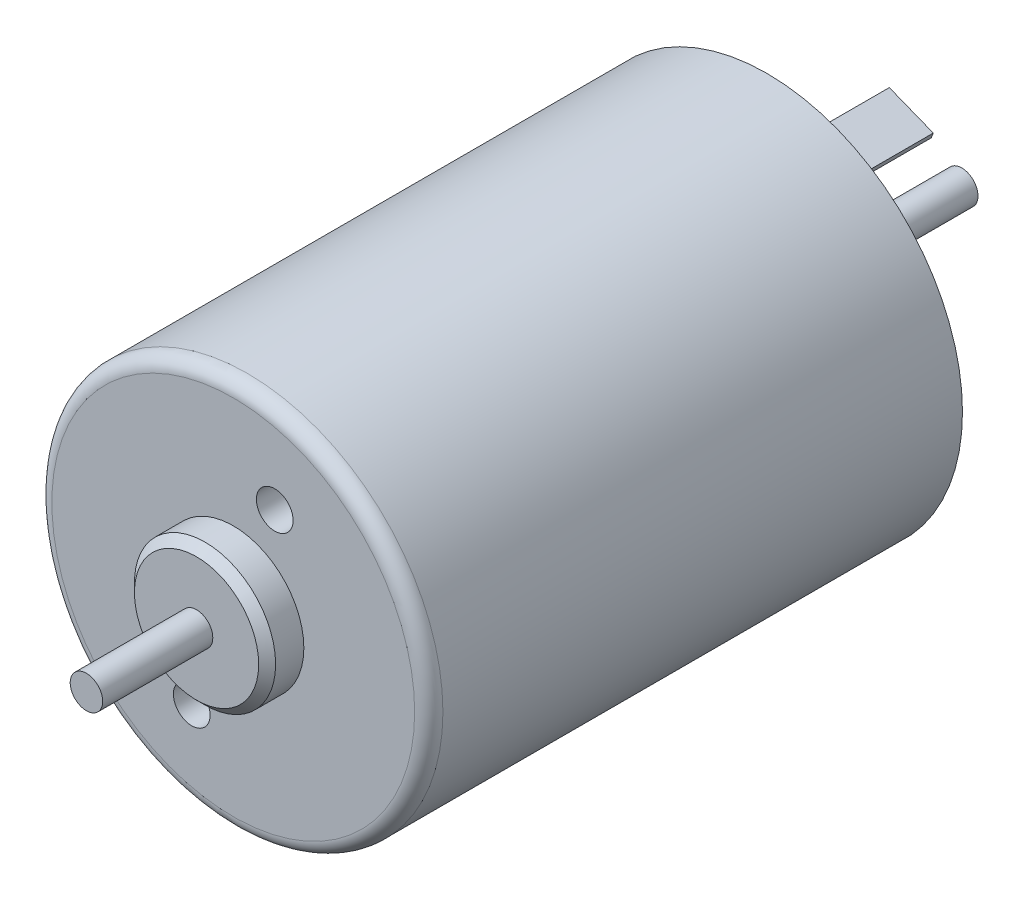
ISO-10303-21;
HEADER;
FILE_DESCRIPTION(('STEP AP214'),'2;1');
FILE_NAME('part.step','',(''),(''),'','','');
FILE_SCHEMA(('AUTOMOTIVE_DESIGN { 1 0 10303 214 1 1 1 1 }'));
ENDSEC;
DATA;
#1=APPLICATION_CONTEXT('core data for automotive mechanical design processes');
#2=APPLICATION_PROTOCOL_DEFINITION('international standard','automotive_design',2000,#1);
#3=PRODUCT_CONTEXT('',#1,'mechanical');
#4=PRODUCT('Part','Part','',(#3));
#5=PRODUCT_RELATED_PRODUCT_CATEGORY('part','',(#4));
#6=PRODUCT_DEFINITION_FORMATION('','',#4);
#7=PRODUCT_DEFINITION_CONTEXT('part definition',#1,'design');
#8=PRODUCT_DEFINITION('design','',#6,#7);
#9=PRODUCT_DEFINITION_SHAPE('','',#8);
#10=(LENGTH_UNIT() NAMED_UNIT(*) SI_UNIT(.MILLI.,.METRE.));
#11=(NAMED_UNIT(*) PLANE_ANGLE_UNIT() SI_UNIT($,.RADIAN.));
#12=(NAMED_UNIT(*) SI_UNIT($,.STERADIAN.) SOLID_ANGLE_UNIT());
#13=UNCERTAINTY_MEASURE_WITH_UNIT(LENGTH_MEASURE(1.E-05),#10,'distance_accuracy_value','');
#14=(GEOMETRIC_REPRESENTATION_CONTEXT(3) GLOBAL_UNCERTAINTY_ASSIGNED_CONTEXT((#13)) GLOBAL_UNIT_ASSIGNED_CONTEXT((#10,
#11,#12)) REPRESENTATION_CONTEXT('',''));
#15=CARTESIAN_POINT('',(0.,0.,0.));
#16=DIRECTION('',(0.,0.,1.));
#17=DIRECTION('',(1.,0.,0.));
#18=AXIS2_PLACEMENT_3D('',#15,#16,#17);
#19=CARTESIAN_POINT('',(0.,0.,0.));
#20=DIRECTION('',(0.,0.,-1.));
#21=DIRECTION('',(0.,1.,0.));
#22=AXIS2_PLACEMENT_3D('',#19,#20,#21);
#23=PLANE('',#22);
#24=CARTESIAN_POINT('',(0.,0.,0.));
#25=DIRECTION('',(0.,0.,-1.));
#26=DIRECTION('',(0.,1.,0.));
#27=AXIS2_PLACEMENT_3D('',#24,#25,#26);
#28=CIRCLE('',#27,5.);
#29=CARTESIAN_POINT('',(0.,5.,0.));
#30=VERTEX_POINT('',#29);
#31=EDGE_CURVE('E226',#30,#30,#28,.T.);
#32=ORIENTED_EDGE('',*,*,#31,.F.);
#33=EDGE_LOOP('',(#32));
#34=FACE_BOUND('',#33,.T.);
#35=CARTESIAN_POINT('',(0.,0.,0.));
#36=DIRECTION('',(0.,0.,-1.));
#37=DIRECTION('',(0.,1.,0.));
#38=AXIS2_PLACEMENT_3D('',#35,#36,#37);
#39=CIRCLE('',#38,13.85);
#40=CARTESIAN_POINT('',(0.,13.85,0.));
#41=VERTEX_POINT('',#40);
#42=EDGE_CURVE('E155',#41,#41,#39,.T.);
#43=ORIENTED_EDGE('',*,*,#42,.T.);
#44=EDGE_LOOP('',(#43));
#45=FACE_BOUND('',#44,.T.);
#46=DIRECTION('',(-0.93007568020905,0.367367975038207,0.));
#47=VECTOR('',#46,1.);
#48=CARTESIAN_POINT('',(2.51990775857389,10.9391814085095,0.));
#49=LINE('',#48,#47);
#50=CARTESIAN_POINT('',(5.63566128727422,9.70849869213148,0.));
#51=VERTEX_POINT('',#50);
#52=CARTESIAN_POINT('',(2.51990775857389,10.9391814085095,0.));
#53=VERTEX_POINT('',#52);
#54=EDGE_CURVE('E127',#51,#53,#49,.T.);
#55=ORIENTED_EDGE('',*,*,#54,.F.);
#56=DIRECTION('',(-0.367367975038209,-0.93007568020905,0.));
#57=VECTOR('',#56,1.);
#58=CARTESIAN_POINT('',(5.63566128727422,9.70849869213148,0.));
#59=LINE('',#58,#57);
#60=CARTESIAN_POINT('',(5.7826084772895,10.0805289642151,0.));
#61=VERTEX_POINT('',#60);
#62=EDGE_CURVE('E124',#61,#51,#59,.T.);
#63=ORIENTED_EDGE('',*,*,#62,.F.);
#64=DIRECTION('',(0.93007568020905,-0.367367975038207,0.));
#65=VECTOR('',#64,1.);
#66=CARTESIAN_POINT('',(5.7826084772895,10.0805289642151,0.));
#67=LINE('',#66,#65);
#68=CARTESIAN_POINT('',(2.66685494858918,11.3112116805931,0.));
#69=VERTEX_POINT('',#68);
#70=EDGE_CURVE('E136',#69,#61,#67,.T.);
#71=ORIENTED_EDGE('',*,*,#70,.F.);
#72=DIRECTION('',(0.367367975038208,0.93007568020905,0.));
#73=VECTOR('',#72,1.);
#74=CARTESIAN_POINT('',(2.66685494858918,11.3112116805931,0.));
#75=LINE('',#74,#73);
#76=EDGE_CURVE('E144',#53,#69,#75,.T.);
#77=ORIENTED_EDGE('',*,*,#76,.F.);
#78=EDGE_LOOP('',(#55,#63,#71,#77));
#79=FACE_BOUND('',#78,.T.);
#80=DIRECTION('',(-0.930075680209049,0.367367975038209,0.));
#81=VECTOR('',#80,1.);
#82=CARTESIAN_POINT('',(-5.7826084772895,-10.0805289642151,0.));
#83=LINE('',#82,#81);
#84=CARTESIAN_POINT('',(-2.66685494858918,-11.3112116805931,0.));
#85=VERTEX_POINT('',#84);
#86=CARTESIAN_POINT('',(-5.7826084772895,-10.0805289642151,0.));
#87=VERTEX_POINT('',#86);
#88=EDGE_CURVE('E247',#85,#87,#83,.T.);
#89=ORIENTED_EDGE('',*,*,#88,.F.);
#90=DIRECTION('',(-0.36736797503821,-0.930075680209049,0.));
#91=VECTOR('',#90,1.);
#92=CARTESIAN_POINT('',(-2.66685494858918,-11.3112116805931,0.));
#93=LINE('',#92,#91);
#94=CARTESIAN_POINT('',(-2.5199077585739,-10.9391814085095,0.));
#95=VERTEX_POINT('',#94);
#96=EDGE_CURVE('E122',#95,#85,#93,.T.);
#97=ORIENTED_EDGE('',*,*,#96,.F.);
#98=DIRECTION('',(0.930075680209049,-0.367367975038209,0.));
#99=VECTOR('',#98,1.);
#100=CARTESIAN_POINT('',(-2.5199077585739,-10.9391814085095,0.));
#101=LINE('',#100,#99);
#102=CARTESIAN_POINT('',(-5.63566128727422,-9.7084986921315,0.));
#103=VERTEX_POINT('',#102);
#104=EDGE_CURVE('E118',#103,#95,#101,.T.);
#105=ORIENTED_EDGE('',*,*,#104,.F.);
#106=DIRECTION('',(0.367367975038208,0.93007568020905,0.));
#107=VECTOR('',#106,1.);
#108=CARTESIAN_POINT('',(-5.63566128727422,-9.70849869213149,0.));
#109=LINE('',#108,#107);
#110=EDGE_CURVE('E249',#87,#103,#109,.T.);
#111=ORIENTED_EDGE('',*,*,#110,.F.);
#112=EDGE_LOOP('',(#89,#97,#105,#111));
#113=FACE_BOUND('',#112,.T.);
#114=ADVANCED_FACE('F33',(#34,#45,#79,#113),#23,.T.);
#115=CARTESIAN_POINT('',(0.,0.,32.9));
#116=DIRECTION('',(0.,0.,-1.));
#117=DIRECTION('',(0.,1.,0.));
#118=AXIS2_PLACEMENT_3D('',#115,#116,#117);
#119=CYLINDRICAL_SURFACE('',#118,13.85);
#120=CARTESIAN_POINT('',(0.,0.,36.8));
#121=DIRECTION('',(0.,0.,1.));
#122=DIRECTION('',(1.,0.,0.));
#123=AXIS2_PLACEMENT_3D('',#120,#121,#122);
#124=CIRCLE('',#123,13.85);
#125=CARTESIAN_POINT('',(13.85,0.,36.8));
#126=VERTEX_POINT('',#125);
#127=EDGE_CURVE('E11',#126,#126,#124,.F.);
#128=ORIENTED_EDGE('',*,*,#127,.T.);
#129=EDGE_LOOP('',(#128));
#130=FACE_BOUND('',#129,.T.);
#131=ORIENTED_EDGE('',*,*,#42,.F.);
#132=EDGE_LOOP('',(#131));
#133=FACE_BOUND('',#132,.T.);
#134=ADVANCED_FACE('F185',(#130,#133),#119,.T.);
#135=CARTESIAN_POINT('',(5.63566128727422,9.70849869213148,-6.));
#136=DIRECTION('',(-0.930075680209049,0.367367975038209,0.));
#137=DIRECTION('',(-0.367367975038209,-0.93007568020905,0.));
#138=AXIS2_PLACEMENT_3D('',#135,#136,#137);
#139=PLANE('',#138);
#140=ORIENTED_EDGE('',*,*,#62,.T.);
#141=DIRECTION('',(0.,0.,1.));
#142=VECTOR('',#141,1.);
#143=CARTESIAN_POINT('',(5.63566128727422,9.70849869213148,-6.));
#144=LINE('',#143,#142);
#145=CARTESIAN_POINT('',(5.63566128727422,9.70849869213148,-6.));
#146=VERTEX_POINT('',#145);
#147=EDGE_CURVE('E153',#146,#51,#144,.T.);
#148=ORIENTED_EDGE('',*,*,#147,.F.);
#149=DIRECTION('',(-0.367367975038209,-0.93007568020905,0.));
#150=VECTOR('',#149,1.);
#151=CARTESIAN_POINT('',(5.63566128727422,9.70849869213148,-6.));
#152=LINE('',#151,#150);
#153=CARTESIAN_POINT('',(5.7826084772895,10.0805289642151,-6.));
#154=VERTEX_POINT('',#153);
#155=EDGE_CURVE('E132',#154,#146,#152,.T.);
#156=ORIENTED_EDGE('',*,*,#155,.F.);
#157=DIRECTION('',(0.,0.,1.));
#158=VECTOR('',#157,1.);
#159=CARTESIAN_POINT('',(5.7826084772895,10.0805289642151,-6.));
#160=LINE('',#159,#158);
#161=EDGE_CURVE('E141',#154,#61,#160,.T.);
#162=ORIENTED_EDGE('',*,*,#161,.T.);
#163=EDGE_LOOP('',(#140,#148,#156,#162));
#164=FACE_BOUND('',#163,.T.);
#165=ADVANCED_FACE('F191',(#164),#139,.F.);
#166=CARTESIAN_POINT('',(2.51990775857389,10.9391814085095,-6.));
#167=DIRECTION('',(0.367367975038207,0.93007568020905,0.));
#168=DIRECTION('',(-0.93007568020905,0.367367975038207,0.));
#169=AXIS2_PLACEMENT_3D('',#166,#167,#168);
#170=PLANE('',#169);
#171=ORIENTED_EDGE('',*,*,#54,.T.);
#172=DIRECTION('',(0.,0.,1.));
#173=VECTOR('',#172,1.);
#174=CARTESIAN_POINT('',(2.51990775857389,10.9391814085095,-6.));
#175=LINE('',#174,#173);
#176=CARTESIAN_POINT('',(2.51990775857389,10.9391814085095,-6.));
#177=VERTEX_POINT('',#176);
#178=EDGE_CURVE('E150',#177,#53,#175,.T.);
#179=ORIENTED_EDGE('',*,*,#178,.F.);
#180=DIRECTION('',(-0.93007568020905,0.367367975038207,0.));
#181=VECTOR('',#180,1.);
#182=CARTESIAN_POINT('',(2.51990775857389,10.9391814085095,-6.));
#183=LINE('',#182,#181);
#184=EDGE_CURVE('E135',#146,#177,#183,.T.);
#185=ORIENTED_EDGE('',*,*,#184,.F.);
#186=ORIENTED_EDGE('',*,*,#147,.T.);
#187=EDGE_LOOP('',(#171,#179,#185,#186));
#188=FACE_BOUND('',#187,.T.);
#189=ADVANCED_FACE('F281',(#188),#170,.F.);
#190=CARTESIAN_POINT('',(2.66685494858918,11.3112116805931,-6.));
#191=DIRECTION('',(0.93007568020905,-0.367367975038208,0.));
#192=DIRECTION('',(0.367367975038208,0.93007568020905,0.));
#193=AXIS2_PLACEMENT_3D('',#190,#191,#192);
#194=PLANE('',#193);
#195=ORIENTED_EDGE('',*,*,#76,.T.);
#196=DIRECTION('',(0.,0.,1.));
#197=VECTOR('',#196,1.);
#198=CARTESIAN_POINT('',(2.66685494858918,11.3112116805931,-6.));
#199=LINE('',#198,#197);
#200=CARTESIAN_POINT('',(2.66685494858918,11.3112116805931,-6.));
#201=VERTEX_POINT('',#200);
#202=EDGE_CURVE('E56',#201,#69,#199,.T.);
#203=ORIENTED_EDGE('',*,*,#202,.F.);
#204=DIRECTION('',(0.367367975038208,0.93007568020905,0.));
#205=VECTOR('',#204,1.);
#206=CARTESIAN_POINT('',(2.66685494858918,11.3112116805931,-6.));
#207=LINE('',#206,#205);
#208=EDGE_CURVE('E138',#177,#201,#207,.T.);
#209=ORIENTED_EDGE('',*,*,#208,.F.);
#210=ORIENTED_EDGE('',*,*,#178,.T.);
#211=EDGE_LOOP('',(#195,#203,#209,#210));
#212=FACE_BOUND('',#211,.T.);
#213=ADVANCED_FACE('F279',(#212),#194,.F.);
#214=CARTESIAN_POINT('',(5.7826084772895,10.0805289642151,-6.));
#215=DIRECTION('',(-0.367367975038207,-0.93007568020905,0.));
#216=DIRECTION('',(0.93007568020905,-0.367367975038207,0.));
#217=AXIS2_PLACEMENT_3D('',#214,#215,#216);
#218=PLANE('',#217);
#219=ORIENTED_EDGE('',*,*,#70,.T.);
#220=ORIENTED_EDGE('',*,*,#161,.F.);
#221=DIRECTION('',(0.93007568020905,-0.367367975038207,0.));
#222=VECTOR('',#221,1.);
#223=CARTESIAN_POINT('',(5.7826084772895,10.0805289642151,-6.));
#224=LINE('',#223,#222);
#225=EDGE_CURVE('E140',#201,#154,#224,.T.);
#226=ORIENTED_EDGE('',*,*,#225,.F.);
#227=ORIENTED_EDGE('',*,*,#202,.T.);
#228=EDGE_LOOP('',(#219,#220,#226,#227));
#229=FACE_BOUND('',#228,.T.);
#230=ADVANCED_FACE('F275',(#229),#218,.F.);
#231=CARTESIAN_POINT('',(0.,0.,-6.));
#232=DIRECTION('',(0.,0.,1.));
#233=DIRECTION('',(0.,-1.,0.));
#234=AXIS2_PLACEMENT_3D('',#231,#232,#233);
#235=PLANE('',#234);
#236=ORIENTED_EDGE('',*,*,#155,.T.);
#237=ORIENTED_EDGE('',*,*,#184,.T.);
#238=ORIENTED_EDGE('',*,*,#208,.T.);
#239=ORIENTED_EDGE('',*,*,#225,.T.);
#240=EDGE_LOOP('',(#236,#237,#238,#239));
#241=FACE_BOUND('',#240,.T.);
#242=ADVANCED_FACE('F272',(#241),#235,.F.);
#243=CARTESIAN_POINT('',(-2.66685494858918,-11.3112116805931,-6.));
#244=DIRECTION('',(-0.930075680209049,0.36736797503821,0.));
#245=DIRECTION('',(-0.36736797503821,-0.930075680209049,0.));
#246=AXIS2_PLACEMENT_3D('',#243,#244,#245);
#247=PLANE('',#246);
#248=ORIENTED_EDGE('',*,*,#96,.T.);
#249=DIRECTION('',(0.,0.,1.));
#250=VECTOR('',#249,1.);
#251=CARTESIAN_POINT('',(-2.66685494858918,-11.3112116805931,-6.));
#252=LINE('',#251,#250);
#253=CARTESIAN_POINT('',(-2.66685494858918,-11.3112116805931,-6.));
#254=VERTEX_POINT('',#253);
#255=EDGE_CURVE('E103',#254,#85,#252,.T.);
#256=ORIENTED_EDGE('',*,*,#255,.F.);
#257=DIRECTION('',(-0.36736797503821,-0.930075680209049,0.));
#258=VECTOR('',#257,1.);
#259=CARTESIAN_POINT('',(-2.66685494858918,-11.3112116805931,-6.));
#260=LINE('',#259,#258);
#261=CARTESIAN_POINT('',(-2.5199077585739,-10.9391814085095,-6.));
#262=VERTEX_POINT('',#261);
#263=EDGE_CURVE('E110',#262,#254,#260,.T.);
#264=ORIENTED_EDGE('',*,*,#263,.F.);
#265=DIRECTION('',(0.,0.,1.));
#266=VECTOR('',#265,1.);
#267=CARTESIAN_POINT('',(-2.5199077585739,-10.9391814085095,-6.));
#268=LINE('',#267,#266);
#269=EDGE_CURVE('E245',#262,#95,#268,.T.);
#270=ORIENTED_EDGE('',*,*,#269,.T.);
#271=EDGE_LOOP('',(#248,#256,#264,#270));
#272=FACE_BOUND('',#271,.T.);
#273=ADVANCED_FACE('F120',(#272),#247,.F.);
#274=CARTESIAN_POINT('',(-5.7826084772895,-10.0805289642151,-6.));
#275=DIRECTION('',(0.367367975038209,0.930075680209049,0.));
#276=DIRECTION('',(-0.93007568020905,0.367367975038209,0.));
#277=AXIS2_PLACEMENT_3D('',#274,#275,#276);
#278=PLANE('',#277);
#279=ORIENTED_EDGE('',*,*,#88,.T.);
#280=DIRECTION('',(0.,0.,1.));
#281=VECTOR('',#280,1.);
#282=CARTESIAN_POINT('',(-5.7826084772895,-10.0805289642151,-6.));
#283=LINE('',#282,#281);
#284=CARTESIAN_POINT('',(-5.7826084772895,-10.0805289642151,-6.));
#285=VERTEX_POINT('',#284);
#286=EDGE_CURVE('E106',#285,#87,#283,.T.);
#287=ORIENTED_EDGE('',*,*,#286,.F.);
#288=DIRECTION('',(-0.930075680209049,0.367367975038209,0.));
#289=VECTOR('',#288,1.);
#290=CARTESIAN_POINT('',(-5.7826084772895,-10.0805289642151,-6.));
#291=LINE('',#290,#289);
#292=EDGE_CURVE('E99',#254,#285,#291,.T.);
#293=ORIENTED_EDGE('',*,*,#292,.F.);
#294=ORIENTED_EDGE('',*,*,#255,.T.);
#295=EDGE_LOOP('',(#279,#287,#293,#294));
#296=FACE_BOUND('',#295,.T.);
#297=ADVANCED_FACE('F101',(#296),#278,.F.);
#298=CARTESIAN_POINT('',(-5.63566128727422,-9.70849869213149,-6.));
#299=DIRECTION('',(0.930075680209049,-0.367367975038208,0.));
#300=DIRECTION('',(0.367367975038208,0.93007568020905,0.));
#301=AXIS2_PLACEMENT_3D('',#298,#299,#300);
#302=PLANE('',#301);
#303=ORIENTED_EDGE('',*,*,#110,.T.);
#304=DIRECTION('',(0.,0.,1.));
#305=VECTOR('',#304,1.);
#306=CARTESIAN_POINT('',(-5.63566128727422,-9.70849869213149,-6.));
#307=LINE('',#306,#305);
#308=CARTESIAN_POINT('',(-5.63566128727422,-9.70849869213149,-6.));
#309=VERTEX_POINT('',#308);
#310=EDGE_CURVE('E48',#309,#103,#307,.T.);
#311=ORIENTED_EDGE('',*,*,#310,.F.);
#312=DIRECTION('',(0.367367975038208,0.93007568020905,0.));
#313=VECTOR('',#312,1.);
#314=CARTESIAN_POINT('',(-5.63566128727422,-9.70849869213149,-6.));
#315=LINE('',#314,#313);
#316=EDGE_CURVE('E109',#285,#309,#315,.T.);
#317=ORIENTED_EDGE('',*,*,#316,.F.);
#318=ORIENTED_EDGE('',*,*,#286,.T.);
#319=EDGE_LOOP('',(#303,#311,#317,#318));
#320=FACE_BOUND('',#319,.T.);
#321=ADVANCED_FACE('F256',(#320),#302,.F.);
#322=CARTESIAN_POINT('',(-2.5199077585739,-10.9391814085095,-6.));
#323=DIRECTION('',(-0.367367975038209,-0.93007568020905,0.));
#324=DIRECTION('',(0.93007568020905,-0.367367975038209,0.));
#325=AXIS2_PLACEMENT_3D('',#322,#323,#324);
#326=PLANE('',#325);
#327=ORIENTED_EDGE('',*,*,#104,.T.);
#328=ORIENTED_EDGE('',*,*,#269,.F.);
#329=DIRECTION('',(0.930075680209049,-0.367367975038209,0.));
#330=VECTOR('',#329,1.);
#331=CARTESIAN_POINT('',(-2.5199077585739,-10.9391814085095,-6.));
#332=LINE('',#331,#330);
#333=EDGE_CURVE('E114',#309,#262,#332,.T.);
#334=ORIENTED_EDGE('',*,*,#333,.F.);
#335=ORIENTED_EDGE('',*,*,#310,.T.);
#336=EDGE_LOOP('',(#327,#328,#334,#335));
#337=FACE_BOUND('',#336,.T.);
#338=ADVANCED_FACE('F257',(#337),#326,.F.);
#339=CARTESIAN_POINT('',(0.,0.,-6.));
#340=DIRECTION('',(0.,0.,1.));
#341=DIRECTION('',(0.,-1.,0.));
#342=AXIS2_PLACEMENT_3D('',#339,#340,#341);
#343=PLANE('',#342);
#344=ORIENTED_EDGE('',*,*,#263,.T.);
#345=ORIENTED_EDGE('',*,*,#292,.T.);
#346=ORIENTED_EDGE('',*,*,#316,.T.);
#347=ORIENTED_EDGE('',*,*,#333,.T.);
#348=EDGE_LOOP('',(#344,#345,#346,#347));
#349=FACE_BOUND('',#348,.T.);
#350=ADVANCED_FACE('F113',(#349),#343,.F.);
#351=CARTESIAN_POINT('',(0.,0.,37.8));
#352=DIRECTION('',(0.,0.,1.));
#353=DIRECTION('',(1.,0.,0.));
#354=AXIS2_PLACEMENT_3D('',#351,#352,#353);
#355=PLANE('',#354);
#356=CARTESIAN_POINT('',(0.,0.,37.8));
#357=DIRECTION('',(0.,0.,1.));
#358=DIRECTION('',(1.,0.,0.));
#359=AXIS2_PLACEMENT_3D('',#356,#357,#358);
#360=CIRCLE('',#359,12.85);
#361=CARTESIAN_POINT('',(12.85,0.,37.8));
#362=VERTEX_POINT('',#361);
#363=EDGE_CURVE('E41',#362,#362,#360,.T.);
#364=ORIENTED_EDGE('',*,*,#363,.T.);
#365=EDGE_LOOP('',(#364));
#366=FACE_BOUND('',#365,.T.);
#367=CARTESIAN_POINT('',(-2.93894380030564,-7.44060544167245,37.8));
#368=DIRECTION('',(0.,0.,1.));
#369=DIRECTION('',(1.,0.,0.));
#370=AXIS2_PLACEMENT_3D('',#367,#368,#369);
#371=CIRCLE('',#370,1.29999999999999);
#372=CARTESIAN_POINT('',(-1.63894380030565,-7.44060544167245,37.8));
#373=VERTEX_POINT('',#372);
#374=EDGE_CURVE('E520',#373,#373,#371,.T.);
#375=ORIENTED_EDGE('',*,*,#374,.F.);
#376=EDGE_LOOP('',(#375));
#377=FACE_BOUND('',#376,.T.);
#378=CARTESIAN_POINT('',(2.93894380030561,7.44060544167238,37.8));
#379=DIRECTION('',(0.,0.,1.));
#380=DIRECTION('',(1.,0.,0.));
#381=AXIS2_PLACEMENT_3D('',#378,#379,#380);
#382=CIRCLE('',#381,1.29999999999999);
#383=CARTESIAN_POINT('',(4.2389438003056,7.44060544167238,37.8));
#384=VERTEX_POINT('',#383);
#385=EDGE_CURVE('E229',#384,#384,#382,.T.);
#386=ORIENTED_EDGE('',*,*,#385,.F.);
#387=EDGE_LOOP('',(#386));
#388=FACE_BOUND('',#387,.T.);
#389=CARTESIAN_POINT('',(0.,0.,37.8));
#390=DIRECTION('',(0.,0.,1.));
#391=DIRECTION('',(1.,0.,0.));
#392=AXIS2_PLACEMENT_3D('',#389,#390,#391);
#393=CIRCLE('',#392,5.);
#394=CARTESIAN_POINT('',(5.,0.,37.8));
#395=VERTEX_POINT('',#394);
#396=EDGE_CURVE('E238',#395,#395,#393,.T.);
#397=ORIENTED_EDGE('',*,*,#396,.F.);
#398=EDGE_LOOP('',(#397));
#399=FACE_BOUND('',#398,.T.);
#400=ADVANCED_FACE('F172',(#366,#377,#388,#399),#355,.T.);
#401=CARTESIAN_POINT('',(0.,0.,40.4));
#402=DIRECTION('',(0.,0.,-1.));
#403=DIRECTION('',(-1.,0.,0.));
#404=AXIS2_PLACEMENT_3D('',#401,#402,#403);
#405=CYLINDRICAL_SURFACE('',#404,5.);
#406=CARTESIAN_POINT('',(0.,0.,39.7999999999734));
#407=DIRECTION('',(0.,0.,1.));
#408=DIRECTION('',(1.,0.,0.));
#409=AXIS2_PLACEMENT_3D('',#406,#407,#408);
#410=CIRCLE('',#409,5.);
#411=CARTESIAN_POINT('',(5.,0.,39.7999999999734));
#412=VERTEX_POINT('',#411);
#413=EDGE_CURVE('E167',#412,#412,#410,.F.);
#414=ORIENTED_EDGE('',*,*,#413,.T.);
#415=EDGE_LOOP('',(#414));
#416=FACE_BOUND('',#415,.T.);
#417=ORIENTED_EDGE('',*,*,#396,.T.);
#418=EDGE_LOOP('',(#417));
#419=FACE_BOUND('',#418,.T.);
#420=ADVANCED_FACE('F318',(#416,#419),#405,.T.);
#421=CARTESIAN_POINT('',(0.,0.,40.4));
#422=DIRECTION('',(0.,0.,1.));
#423=DIRECTION('',(1.,0.,0.));
#424=AXIS2_PLACEMENT_3D('',#421,#422,#423);
#425=PLANE('',#424);
#426=CARTESIAN_POINT('',(0.,0.,40.4));
#427=DIRECTION('',(0.,0.,1.));
#428=DIRECTION('',(1.,0.,0.));
#429=AXIS2_PLACEMENT_3D('',#426,#427,#428);
#430=CIRCLE('',#429,4.39999999998534);
#431=CARTESIAN_POINT('',(4.39999999998534,0.,40.4));
#432=VERTEX_POINT('',#431);
#433=EDGE_CURVE('E164',#432,#432,#430,.T.);
#434=ORIENTED_EDGE('',*,*,#433,.T.);
#435=EDGE_LOOP('',(#434));
#436=FACE_BOUND('',#435,.T.);
#437=CARTESIAN_POINT('',(0.,0.,40.4));
#438=DIRECTION('',(0.,0.,1.));
#439=DIRECTION('',(1.,0.,0.));
#440=AXIS2_PLACEMENT_3D('',#437,#438,#439);
#441=CIRCLE('',#440,1.15);
#442=CARTESIAN_POINT('',(1.15,0.,40.4));
#443=VERTEX_POINT('',#442);
#444=EDGE_CURVE('E234',#443,#443,#441,.T.);
#445=ORIENTED_EDGE('',*,*,#444,.F.);
#446=EDGE_LOOP('',(#445));
#447=FACE_BOUND('',#446,.T.);
#448=ADVANCED_FACE('F413',(#436,#447),#425,.T.);
#449=CARTESIAN_POINT('',(0.,0.,48.2));
#450=DIRECTION('',(0.,0.,-1.));
#451=DIRECTION('',(-1.,0.,0.));
#452=AXIS2_PLACEMENT_3D('',#449,#450,#451);
#453=CYLINDRICAL_SURFACE('',#452,1.15);
#454=CARTESIAN_POINT('',(0.,0.,48.2));
#455=DIRECTION('',(0.,0.,1.));
#456=DIRECTION('',(1.,0.,0.));
#457=AXIS2_PLACEMENT_3D('',#454,#455,#456);
#458=CIRCLE('',#457,1.15);
#459=CARTESIAN_POINT('',(1.15,0.,48.2));
#460=VERTEX_POINT('',#459);
#461=EDGE_CURVE('E235',#460,#460,#458,.T.);
#462=ORIENTED_EDGE('',*,*,#461,.F.);
#463=EDGE_LOOP('',(#462));
#464=FACE_BOUND('',#463,.T.);
#465=ORIENTED_EDGE('',*,*,#444,.T.);
#466=EDGE_LOOP('',(#465));
#467=FACE_BOUND('',#466,.T.);
#468=ADVANCED_FACE('F404',(#464,#467),#453,.T.);
#469=CARTESIAN_POINT('',(0.,0.,48.2));
#470=DIRECTION('',(0.,0.,1.));
#471=DIRECTION('',(1.,0.,0.));
#472=AXIS2_PLACEMENT_3D('',#469,#470,#471);
#473=PLANE('',#472);
#474=ORIENTED_EDGE('',*,*,#461,.T.);
#475=EDGE_LOOP('',(#474));
#476=FACE_BOUND('',#475,.T.);
#477=ADVANCED_FACE('F394',(#476),#473,.T.);
#478=CARTESIAN_POINT('',(0.,0.,-2.6));
#479=DIRECTION('',(0.,0.,1.));
#480=DIRECTION('',(0.,-1.,0.));
#481=AXIS2_PLACEMENT_3D('',#478,#479,#480);
#482=CYLINDRICAL_SURFACE('',#481,5.);
#483=CARTESIAN_POINT('',(0.,0.,-1.99999999997344));
#484=DIRECTION('',(0.,0.,-1.));
#485=DIRECTION('',(0.,1.,0.));
#486=AXIS2_PLACEMENT_3D('',#483,#484,#485);
#487=CIRCLE('',#486,5.);
#488=CARTESIAN_POINT('',(0.,5.,-1.99999999997344));
#489=VERTEX_POINT('',#488);
#490=EDGE_CURVE('E161',#489,#489,#487,.F.);
#491=ORIENTED_EDGE('',*,*,#490,.T.);
#492=EDGE_LOOP('',(#491));
#493=FACE_BOUND('',#492,.T.);
#494=ORIENTED_EDGE('',*,*,#31,.T.);
#495=EDGE_LOOP('',(#494));
#496=FACE_BOUND('',#495,.T.);
#497=ADVANCED_FACE('F216',(#493,#496),#482,.T.);
#498=CARTESIAN_POINT('',(0.,0.,-2.6));
#499=DIRECTION('',(0.,0.,-1.));
#500=DIRECTION('',(0.,1.,0.));
#501=AXIS2_PLACEMENT_3D('',#498,#499,#500);
#502=PLANE('',#501);
#503=CARTESIAN_POINT('',(0.,0.,-2.6));
#504=DIRECTION('',(0.,0.,-1.));
#505=DIRECTION('',(0.,1.,0.));
#506=AXIS2_PLACEMENT_3D('',#503,#504,#505);
#507=CIRCLE('',#506,4.39999999998533);
#508=CARTESIAN_POINT('',(0.,4.39999999998533,-2.6));
#509=VERTEX_POINT('',#508);
#510=EDGE_CURVE('E158',#509,#509,#507,.T.);
#511=ORIENTED_EDGE('',*,*,#510,.T.);
#512=EDGE_LOOP('',(#511));
#513=FACE_BOUND('',#512,.T.);
#514=CARTESIAN_POINT('',(0.,0.,-2.6));
#515=DIRECTION('',(0.,0.,-1.));
#516=DIRECTION('',(0.,1.,0.));
#517=AXIS2_PLACEMENT_3D('',#514,#515,#516);
#518=CIRCLE('',#517,1.15);
#519=CARTESIAN_POINT('',(0.,1.15,-2.6));
#520=VERTEX_POINT('',#519);
#521=EDGE_CURVE('E220',#520,#520,#518,.T.);
#522=ORIENTED_EDGE('',*,*,#521,.F.);
#523=EDGE_LOOP('',(#522));
#524=FACE_BOUND('',#523,.T.);
#525=ADVANCED_FACE('F212',(#513,#524),#502,.T.);
#526=CARTESIAN_POINT('',(0.,0.,-13.8));
#527=DIRECTION('',(0.,0.,1.));
#528=DIRECTION('',(0.,-1.,0.));
#529=AXIS2_PLACEMENT_3D('',#526,#527,#528);
#530=CYLINDRICAL_SURFACE('',#529,1.15);
#531=CARTESIAN_POINT('',(0.,0.,-13.8));
#532=DIRECTION('',(0.,0.,-1.));
#533=DIRECTION('',(0.,1.,0.));
#534=AXIS2_PLACEMENT_3D('',#531,#532,#533);
#535=CIRCLE('',#534,1.15);
#536=CARTESIAN_POINT('',(0.,1.15,-13.8));
#537=VERTEX_POINT('',#536);
#538=EDGE_CURVE('E222',#537,#537,#535,.T.);
#539=ORIENTED_EDGE('',*,*,#538,.F.);
#540=EDGE_LOOP('',(#539));
#541=FACE_BOUND('',#540,.T.);
#542=ORIENTED_EDGE('',*,*,#521,.T.);
#543=EDGE_LOOP('',(#542));
#544=FACE_BOUND('',#543,.T.);
#545=ADVANCED_FACE('F215',(#541,#544),#530,.T.);
#546=CARTESIAN_POINT('',(0.,0.,-13.8));
#547=DIRECTION('',(0.,0.,-1.));
#548=DIRECTION('',(0.,1.,0.));
#549=AXIS2_PLACEMENT_3D('',#546,#547,#548);
#550=PLANE('',#549);
#551=ORIENTED_EDGE('',*,*,#538,.T.);
#552=EDGE_LOOP('',(#551));
#553=FACE_BOUND('',#552,.T.);
#554=ADVANCED_FACE('F365',(#553),#550,.T.);
#555=CARTESIAN_POINT('',(2.93894380030561,7.44060544167238,34.5836800131004));
#556=DIRECTION('',(0.,0.,-1.));
#557=DIRECTION('',(-1.,0.,0.));
#558=AXIS2_PLACEMENT_3D('',#555,#556,#557);
#559=PLANE('',#558);
#560=CARTESIAN_POINT('',(2.93894380030561,7.44060544167238,34.5836800131004));
#561=DIRECTION('',(0.,0.,1.));
#562=DIRECTION('',(1.,0.,0.));
#563=AXIS2_PLACEMENT_3D('',#560,#561,#562);
#564=CIRCLE('',#563,1.29999999999999);
#565=CARTESIAN_POINT('',(4.2389438003056,7.44060544167238,34.5836800131004));
#566=VERTEX_POINT('',#565);
#567=EDGE_CURVE('E223',#566,#566,#564,.T.);
#568=ORIENTED_EDGE('',*,*,#567,.T.);
#569=EDGE_LOOP('',(#568));
#570=FACE_BOUND('',#569,.T.);
#571=ADVANCED_FACE('F356',(#570),#559,.F.);
#572=CARTESIAN_POINT('',(2.93894380030561,7.44060544167238,37.8));
#573=DIRECTION('',(0.,0.,1.));
#574=DIRECTION('',(1.,0.,0.));
#575=AXIS2_PLACEMENT_3D('',#572,#573,#574);
#576=CYLINDRICAL_SURFACE('',#575,1.29999999999999);
#577=ORIENTED_EDGE('',*,*,#567,.F.);
#578=EDGE_LOOP('',(#577));
#579=FACE_BOUND('',#578,.T.);
#580=ORIENTED_EDGE('',*,*,#385,.T.);
#581=EDGE_LOOP('',(#580));
#582=FACE_BOUND('',#581,.T.);
#583=ADVANCED_FACE('F347',(#579,#582),#576,.F.);
#584=CARTESIAN_POINT('',(-2.93894380030564,-7.44060544167245,34.5836800131004));
#585=DIRECTION('',(0.,0.,-1.));
#586=DIRECTION('',(-1.,0.,0.));
#587=AXIS2_PLACEMENT_3D('',#584,#585,#586);
#588=PLANE('',#587);
#589=CARTESIAN_POINT('',(-2.93894380030564,-7.44060544167245,34.5836800131004));
#590=DIRECTION('',(0.,0.,1.));
#591=DIRECTION('',(1.,0.,0.));
#592=AXIS2_PLACEMENT_3D('',#589,#590,#591);
#593=CIRCLE('',#592,1.29999999999999);
#594=CARTESIAN_POINT('',(-1.63894380030566,-7.44060544167245,34.5836800131004));
#595=VERTEX_POINT('',#594);
#596=EDGE_CURVE('E517',#595,#595,#593,.T.);
#597=ORIENTED_EDGE('',*,*,#596,.T.);
#598=EDGE_LOOP('',(#597));
#599=FACE_BOUND('',#598,.T.);
#600=ADVANCED_FACE('F205',(#599),#588,.F.);
#601=CARTESIAN_POINT('',(-2.93894380030564,-7.44060544167245,37.8));
#602=DIRECTION('',(0.,0.,1.));
#603=DIRECTION('',(1.,0.,0.));
#604=AXIS2_PLACEMENT_3D('',#601,#602,#603);
#605=CYLINDRICAL_SURFACE('',#604,1.29999999999999);
#606=ORIENTED_EDGE('',*,*,#596,.F.);
#607=EDGE_LOOP('',(#606));
#608=FACE_BOUND('',#607,.T.);
#609=ORIENTED_EDGE('',*,*,#374,.T.);
#610=EDGE_LOOP('',(#609));
#611=FACE_BOUND('',#610,.T.);
#612=ADVANCED_FACE('F200',(#608,#611),#605,.F.);
#613=CARTESIAN_POINT('',(0.,0.,-2.6));
#614=DIRECTION('',(0.,0.,1.));
#615=DIRECTION('',(0.,-1.,0.));
#616=AXIS2_PLACEMENT_3D('',#613,#614,#615);
#617=CONICAL_SURFACE('',#616,4.39999999998533,0.785398163387543);
#618=ORIENTED_EDGE('',*,*,#490,.F.);
#619=EDGE_LOOP('',(#618));
#620=FACE_BOUND('',#619,.T.);
#621=ORIENTED_EDGE('',*,*,#510,.F.);
#622=EDGE_LOOP('',(#621));
#623=FACE_BOUND('',#622,.T.);
#624=ADVANCED_FACE('F181',(#620,#623),#617,.T.);
#625=CARTESIAN_POINT('',(0.,0.,40.4));
#626=DIRECTION('',(0.,0.,-1.));
#627=DIRECTION('',(-1.,0.,0.));
#628=AXIS2_PLACEMENT_3D('',#625,#626,#627);
#629=CONICAL_SURFACE('',#628,4.39999999998534,0.78539816338754);
#630=ORIENTED_EDGE('',*,*,#413,.F.);
#631=EDGE_LOOP('',(#630));
#632=FACE_BOUND('',#631,.T.);
#633=ORIENTED_EDGE('',*,*,#433,.F.);
#634=EDGE_LOOP('',(#633));
#635=FACE_BOUND('',#634,.T.);
#636=ADVANCED_FACE('F176',(#632,#635),#629,.T.);
#637=CARTESIAN_POINT('',(0.,0.,36.8));
#638=DIRECTION('',(0.,0.,1.));
#639=DIRECTION('',(1.,0.,0.));
#640=AXIS2_PLACEMENT_3D('',#637,#638,#639);
#641=TOROIDAL_SURFACE('',#640,12.85,0.999999999999999);
#642=ORIENTED_EDGE('',*,*,#127,.F.);
#643=EDGE_LOOP('',(#642));
#644=FACE_BOUND('',#643,.T.);
#645=ORIENTED_EDGE('',*,*,#363,.F.);
#646=EDGE_LOOP('',(#645));
#647=FACE_BOUND('',#646,.T.);
#648=ADVANCED_FACE('F35',(#644,#647),#641,.T.);
#649=CLOSED_SHELL('',(#114,#134,#165,#189,#213,#230,#242,#273,#297,#321,#338,#350,#400,#420,
#448,#468,#477,#497,#525,#545,#554,#571,#583,#600,#612,#624,#636,#648));
#650=MANIFOLD_SOLID_BREP('B2',#649);
#651=ADVANCED_BREP_SHAPE_REPRESENTATION('',(#18,#650),#14);
#652=SHAPE_DEFINITION_REPRESENTATION(#9,#651);
ENDSEC;
END-ISO-10303-21;
